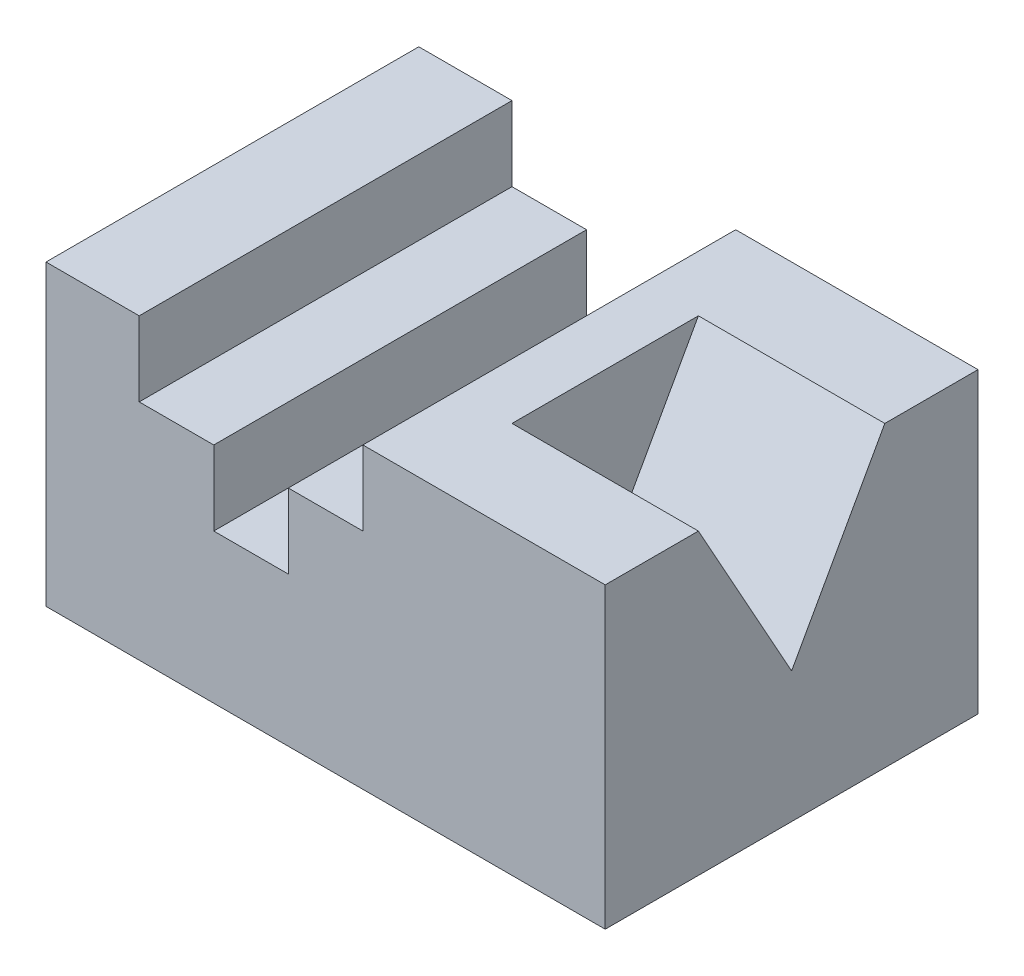
ISO-10303-21;
HEADER;
FILE_DESCRIPTION(('STEP AP214'),'2;1');
FILE_NAME('part.step','',(''),(''),'','','');
FILE_SCHEMA(('AUTOMOTIVE_DESIGN { 1 0 10303 214 1 1 1 1 }'));
ENDSEC;
DATA;
#1=APPLICATION_CONTEXT('core data for automotive mechanical design processes');
#2=APPLICATION_PROTOCOL_DEFINITION('international standard','automotive_design',2000,#1);
#3=PRODUCT_CONTEXT('',#1,'mechanical');
#4=PRODUCT('Part','Part','',(#3));
#5=PRODUCT_RELATED_PRODUCT_CATEGORY('part','',(#4));
#6=PRODUCT_DEFINITION_FORMATION('','',#4);
#7=PRODUCT_DEFINITION_CONTEXT('part definition',#1,'design');
#8=PRODUCT_DEFINITION('design','',#6,#7);
#9=PRODUCT_DEFINITION_SHAPE('','',#8);
#10=(LENGTH_UNIT() NAMED_UNIT(*) SI_UNIT(.MILLI.,.METRE.));
#11=(NAMED_UNIT(*) PLANE_ANGLE_UNIT() SI_UNIT($,.RADIAN.));
#12=(NAMED_UNIT(*) SI_UNIT($,.STERADIAN.) SOLID_ANGLE_UNIT());
#13=UNCERTAINTY_MEASURE_WITH_UNIT(LENGTH_MEASURE(1.E-05),#10,'distance_accuracy_value','');
#14=(GEOMETRIC_REPRESENTATION_CONTEXT(3) GLOBAL_UNCERTAINTY_ASSIGNED_CONTEXT((#13)) GLOBAL_UNIT_ASSIGNED_CONTEXT((#10,
#11,#12)) REPRESENTATION_CONTEXT('',''));
#15=CARTESIAN_POINT('',(0.,0.,0.));
#16=DIRECTION('',(0.,0.,1.));
#17=DIRECTION('',(1.,0.,0.));
#18=AXIS2_PLACEMENT_3D('',#15,#16,#17);
#19=CARTESIAN_POINT('',(150.,0.,50.));
#20=DIRECTION('',(0.,1.,0.));
#21=DIRECTION('',(0.,0.,1.));
#22=AXIS2_PLACEMENT_3D('',#19,#20,#21);
#23=PLANE('',#22);
#24=DIRECTION('',(1.,0.,0.));
#25=VECTOR('',#24,1.);
#26=CARTESIAN_POINT('',(150.,0.,-50.));
#27=LINE('',#26,#25);
#28=CARTESIAN_POINT('',(0.,0.,-50.));
#29=VERTEX_POINT('',#28);
#30=CARTESIAN_POINT('',(150.,0.,-50.));
#31=VERTEX_POINT('',#30);
#32=EDGE_CURVE('E171',#29,#31,#27,.T.);
#33=ORIENTED_EDGE('',*,*,#32,.T.);
#34=DIRECTION('',(0.,0.,-1.));
#35=VECTOR('',#34,1.);
#36=CARTESIAN_POINT('',(150.,0.,50.));
#37=LINE('',#36,#35);
#38=CARTESIAN_POINT('',(150.,0.,50.));
#39=VERTEX_POINT('',#38);
#40=EDGE_CURVE('E11',#39,#31,#37,.T.);
#41=ORIENTED_EDGE('',*,*,#40,.F.);
#42=DIRECTION('',(1.,0.,0.));
#43=VECTOR('',#42,1.);
#44=CARTESIAN_POINT('',(150.,0.,50.));
#45=LINE('',#44,#43);
#46=CARTESIAN_POINT('',(0.,0.,50.));
#47=VERTEX_POINT('',#46);
#48=EDGE_CURVE('E196',#47,#39,#45,.T.);
#49=ORIENTED_EDGE('',*,*,#48,.F.);
#50=DIRECTION('',(0.,0.,-1.));
#51=VECTOR('',#50,1.);
#52=CARTESIAN_POINT('',(0.,0.,50.));
#53=LINE('',#52,#51);
#54=EDGE_CURVE('E167',#47,#29,#53,.T.);
#55=ORIENTED_EDGE('',*,*,#54,.T.);
#56=EDGE_LOOP('',(#33,#41,#49,#55));
#57=FACE_BOUND('',#56,.T.);
#58=ADVANCED_FACE('F39',(#57),#23,.F.);
#59=CARTESIAN_POINT('',(150.,80.,50.));
#60=DIRECTION('',(-1.,0.,0.));
#61=DIRECTION('',(0.,0.,1.));
#62=AXIS2_PLACEMENT_3D('',#59,#60,#61);
#63=PLANE('',#62);
#64=DIRECTION('',(0.,0.874157276121538,-0.485642931178632));
#65=VECTOR('',#64,1.);
#66=CARTESIAN_POINT('',(150.,48.1603773584906,-7.31132075471699));
#67=LINE('',#66,#65);
#68=CARTESIAN_POINT('',(150.,35.,0.));
#69=VERTEX_POINT('',#68);
#70=CARTESIAN_POINT('',(150.,80.,-25.));
#71=VERTEX_POINT('',#70);
#72=EDGE_CURVE('E283',#69,#71,#67,.T.);
#73=ORIENTED_EDGE('',*,*,#72,.F.);
#74=DIRECTION('',(0.,-0.874157276121538,-0.485642931178632));
#75=VECTOR('',#74,1.);
#76=CARTESIAN_POINT('',(150.,90.6132075471698,30.8962264150943));
#77=LINE('',#76,#75);
#78=CARTESIAN_POINT('',(150.,80.,25.));
#79=VERTEX_POINT('',#78);
#80=EDGE_CURVE('E280',#79,#69,#77,.T.);
#81=ORIENTED_EDGE('',*,*,#80,.F.);
#82=DIRECTION('',(0.,0.,-1.));
#83=VECTOR('',#82,1.);
#84=CARTESIAN_POINT('',(150.,80.,50.));
#85=LINE('',#84,#83);
#86=CARTESIAN_POINT('',(150.,80.,50.));
#87=VERTEX_POINT('',#86);
#88=EDGE_CURVE('E46',#87,#79,#85,.T.);
#89=ORIENTED_EDGE('',*,*,#88,.F.);
#90=DIRECTION('',(0.,1.,0.));
#91=VECTOR('',#90,1.);
#92=CARTESIAN_POINT('',(150.,80.,50.));
#93=LINE('',#92,#91);
#94=EDGE_CURVE('E115',#39,#87,#93,.T.);
#95=ORIENTED_EDGE('',*,*,#94,.F.);
#96=ORIENTED_EDGE('',*,*,#40,.T.);
#97=DIRECTION('',(0.,1.,0.));
#98=VECTOR('',#97,1.);
#99=CARTESIAN_POINT('',(150.,80.,-50.));
#100=LINE('',#99,#98);
#101=CARTESIAN_POINT('',(150.,80.,-50.));
#102=VERTEX_POINT('',#101);
#103=EDGE_CURVE('E174',#31,#102,#100,.T.);
#104=ORIENTED_EDGE('',*,*,#103,.T.);
#105=EDGE_CURVE('E217',#71,#102,#85,.T.);
#106=ORIENTED_EDGE('',*,*,#105,.F.);
#107=EDGE_LOOP('',(#73,#81,#89,#95,#96,#104,#106));
#108=FACE_BOUND('',#107,.T.);
#109=ADVANCED_FACE('F231',(#108),#63,.F.);
#110=CARTESIAN_POINT('',(85.,80.,50.));
#111=DIRECTION('',(0.,-1.,0.));
#112=DIRECTION('',(0.,0.,-1.));
#113=AXIS2_PLACEMENT_3D('',#110,#111,#112);
#114=PLANE('',#113);
#115=ORIENTED_EDGE('',*,*,#88,.T.);
#116=DIRECTION('',(1.,0.,0.));
#117=VECTOR('',#116,1.);
#118=CARTESIAN_POINT('',(100.,80.,25.));
#119=LINE('',#118,#117);
#120=CARTESIAN_POINT('',(100.,80.,25.));
#121=VERTEX_POINT('',#120);
#122=EDGE_CURVE('E175',#121,#79,#119,.T.);
#123=ORIENTED_EDGE('',*,*,#122,.F.);
#124=DIRECTION('',(0.,0.,1.));
#125=VECTOR('',#124,1.);
#126=CARTESIAN_POINT('',(100.,80.,50.));
#127=LINE('',#126,#125);
#128=CARTESIAN_POINT('',(100.,80.,-25.));
#129=VERTEX_POINT('',#128);
#130=EDGE_CURVE('E292',#129,#121,#127,.T.);
#131=ORIENTED_EDGE('',*,*,#130,.F.);
#132=DIRECTION('',(1.,0.,0.));
#133=VECTOR('',#132,1.);
#134=CARTESIAN_POINT('',(100.,80.,-25.));
#135=LINE('',#134,#133);
#136=EDGE_CURVE('E229',#129,#71,#135,.T.);
#137=ORIENTED_EDGE('',*,*,#136,.T.);
#138=ORIENTED_EDGE('',*,*,#105,.T.);
#139=DIRECTION('',(-1.,0.,0.));
#140=VECTOR('',#139,1.);
#141=CARTESIAN_POINT('',(85.,80.,-50.));
#142=LINE('',#141,#140);
#143=CARTESIAN_POINT('',(85.,80.,-50.));
#144=VERTEX_POINT('',#143);
#145=EDGE_CURVE('E178',#102,#144,#142,.T.);
#146=ORIENTED_EDGE('',*,*,#145,.T.);
#147=DIRECTION('',(0.,0.,-1.));
#148=VECTOR('',#147,1.);
#149=CARTESIAN_POINT('',(85.,80.,50.));
#150=LINE('',#149,#148);
#151=CARTESIAN_POINT('',(85.,80.,50.));
#152=VERTEX_POINT('',#151);
#153=EDGE_CURVE('E215',#152,#144,#150,.T.);
#154=ORIENTED_EDGE('',*,*,#153,.F.);
#155=DIRECTION('',(-1.,0.,0.));
#156=VECTOR('',#155,1.);
#157=CARTESIAN_POINT('',(85.,80.,50.));
#158=LINE('',#157,#156);
#159=EDGE_CURVE('E254',#87,#152,#158,.T.);
#160=ORIENTED_EDGE('',*,*,#159,.F.);
#161=EDGE_LOOP('',(#115,#123,#131,#137,#138,#146,#154,#160));
#162=FACE_BOUND('',#161,.T.);
#163=ADVANCED_FACE('F224',(#162),#114,.F.);
#164=CARTESIAN_POINT('',(85.,60.,50.));
#165=DIRECTION('',(1.,0.,0.));
#166=DIRECTION('',(0.,1.,0.));
#167=AXIS2_PLACEMENT_3D('',#164,#165,#166);
#168=PLANE('',#167);
#169=DIRECTION('',(0.,-1.,0.));
#170=VECTOR('',#169,1.);
#171=CARTESIAN_POINT('',(85.,60.,-50.));
#172=LINE('',#171,#170);
#173=CARTESIAN_POINT('',(85.,60.,-50.));
#174=VERTEX_POINT('',#173);
#175=EDGE_CURVE('E180',#144,#174,#172,.T.);
#176=ORIENTED_EDGE('',*,*,#175,.T.);
#177=DIRECTION('',(0.,0.,-1.));
#178=VECTOR('',#177,1.);
#179=CARTESIAN_POINT('',(85.,60.,50.));
#180=LINE('',#179,#178);
#181=CARTESIAN_POINT('',(85.,60.,50.));
#182=VERTEX_POINT('',#181);
#183=EDGE_CURVE('E212',#182,#174,#180,.T.);
#184=ORIENTED_EDGE('',*,*,#183,.F.);
#185=DIRECTION('',(0.,-1.,0.));
#186=VECTOR('',#185,1.);
#187=CARTESIAN_POINT('',(85.,60.,50.));
#188=LINE('',#187,#186);
#189=EDGE_CURVE('E250',#152,#182,#188,.T.);
#190=ORIENTED_EDGE('',*,*,#189,.F.);
#191=ORIENTED_EDGE('',*,*,#153,.T.);
#192=EDGE_LOOP('',(#176,#184,#190,#191));
#193=FACE_BOUND('',#192,.T.);
#194=ADVANCED_FACE('F241',(#193),#168,.F.);
#195=CARTESIAN_POINT('',(65.0000000000001,60.,50.));
#196=DIRECTION('',(0.,-1.,0.));
#197=DIRECTION('',(0.,0.,-1.));
#198=AXIS2_PLACEMENT_3D('',#195,#196,#197);
#199=PLANE('',#198);
#200=DIRECTION('',(-1.,0.,0.));
#201=VECTOR('',#200,1.);
#202=CARTESIAN_POINT('',(65.0000000000001,60.,-50.));
#203=LINE('',#202,#201);
#204=CARTESIAN_POINT('',(65.0000000000001,60.,-50.));
#205=VERTEX_POINT('',#204);
#206=EDGE_CURVE('E182',#174,#205,#203,.T.);
#207=ORIENTED_EDGE('',*,*,#206,.T.);
#208=DIRECTION('',(0.,0.,-1.));
#209=VECTOR('',#208,1.);
#210=CARTESIAN_POINT('',(65.0000000000001,60.,50.));
#211=LINE('',#210,#209);
#212=CARTESIAN_POINT('',(65.0000000000001,60.,50.));
#213=VERTEX_POINT('',#212);
#214=EDGE_CURVE('E209',#213,#205,#211,.T.);
#215=ORIENTED_EDGE('',*,*,#214,.F.);
#216=DIRECTION('',(-1.,0.,0.));
#217=VECTOR('',#216,1.);
#218=CARTESIAN_POINT('',(65.0000000000001,60.,50.));
#219=LINE('',#218,#217);
#220=EDGE_CURVE('E247',#182,#213,#219,.T.);
#221=ORIENTED_EDGE('',*,*,#220,.F.);
#222=ORIENTED_EDGE('',*,*,#183,.T.);
#223=EDGE_LOOP('',(#207,#215,#221,#222));
#224=FACE_BOUND('',#223,.T.);
#225=ADVANCED_FACE('F245',(#224),#199,.F.);
#226=CARTESIAN_POINT('',(65.0000000000001,40.,50.));
#227=DIRECTION('',(1.,0.,0.));
#228=DIRECTION('',(0.,0.,-1.));
#229=AXIS2_PLACEMENT_3D('',#226,#227,#228);
#230=PLANE('',#229);
#231=DIRECTION('',(0.,-1.,0.));
#232=VECTOR('',#231,1.);
#233=CARTESIAN_POINT('',(65.0000000000001,40.,-50.));
#234=LINE('',#233,#232);
#235=CARTESIAN_POINT('',(65.0000000000001,40.,-50.));
#236=VERTEX_POINT('',#235);
#237=EDGE_CURVE('E184',#205,#236,#234,.T.);
#238=ORIENTED_EDGE('',*,*,#237,.T.);
#239=DIRECTION('',(0.,0.,-1.));
#240=VECTOR('',#239,1.);
#241=CARTESIAN_POINT('',(65.0000000000001,40.,50.));
#242=LINE('',#241,#240);
#243=CARTESIAN_POINT('',(65.0000000000001,40.,50.));
#244=VERTEX_POINT('',#243);
#245=EDGE_CURVE('E206',#244,#236,#242,.T.);
#246=ORIENTED_EDGE('',*,*,#245,.F.);
#247=DIRECTION('',(0.,-1.,0.));
#248=VECTOR('',#247,1.);
#249=CARTESIAN_POINT('',(65.0000000000001,40.,50.));
#250=LINE('',#249,#248);
#251=EDGE_CURVE('E249',#213,#244,#250,.T.);
#252=ORIENTED_EDGE('',*,*,#251,.F.);
#253=ORIENTED_EDGE('',*,*,#214,.T.);
#254=EDGE_LOOP('',(#238,#246,#252,#253));
#255=FACE_BOUND('',#254,.T.);
#256=ADVANCED_FACE('F327',(#255),#230,.F.);
#257=CARTESIAN_POINT('',(45.0000000000001,40.,50.));
#258=DIRECTION('',(0.,-1.,0.));
#259=DIRECTION('',(0.,0.,-1.));
#260=AXIS2_PLACEMENT_3D('',#257,#258,#259);
#261=PLANE('',#260);
#262=DIRECTION('',(-1.,0.,0.));
#263=VECTOR('',#262,1.);
#264=CARTESIAN_POINT('',(45.0000000000001,40.,-50.));
#265=LINE('',#264,#263);
#266=CARTESIAN_POINT('',(45.0000000000001,40.,-50.));
#267=VERTEX_POINT('',#266);
#268=EDGE_CURVE('E186',#236,#267,#265,.T.);
#269=ORIENTED_EDGE('',*,*,#268,.T.);
#270=DIRECTION('',(0.,0.,-1.));
#271=VECTOR('',#270,1.);
#272=CARTESIAN_POINT('',(45.0000000000001,40.,50.));
#273=LINE('',#272,#271);
#274=CARTESIAN_POINT('',(45.0000000000001,40.,50.));
#275=VERTEX_POINT('',#274);
#276=EDGE_CURVE('E203',#275,#267,#273,.T.);
#277=ORIENTED_EDGE('',*,*,#276,.F.);
#278=DIRECTION('',(-1.,0.,0.));
#279=VECTOR('',#278,1.);
#280=CARTESIAN_POINT('',(45.0000000000001,40.,50.));
#281=LINE('',#280,#279);
#282=EDGE_CURVE('E252',#244,#275,#281,.T.);
#283=ORIENTED_EDGE('',*,*,#282,.F.);
#284=ORIENTED_EDGE('',*,*,#245,.T.);
#285=EDGE_LOOP('',(#269,#277,#283,#284));
#286=FACE_BOUND('',#285,.T.);
#287=ADVANCED_FACE('F330',(#286),#261,.F.);
#288=CARTESIAN_POINT('',(45.0000000000001,60.,50.));
#289=DIRECTION('',(-1.,0.,0.));
#290=DIRECTION('',(0.,0.,1.));
#291=AXIS2_PLACEMENT_3D('',#288,#289,#290);
#292=PLANE('',#291);
#293=DIRECTION('',(0.,1.,0.));
#294=VECTOR('',#293,1.);
#295=CARTESIAN_POINT('',(45.0000000000001,60.,-50.));
#296=LINE('',#295,#294);
#297=CARTESIAN_POINT('',(45.0000000000001,60.,-50.));
#298=VERTEX_POINT('',#297);
#299=EDGE_CURVE('E188',#267,#298,#296,.T.);
#300=ORIENTED_EDGE('',*,*,#299,.T.);
#301=DIRECTION('',(0.,0.,-1.));
#302=VECTOR('',#301,1.);
#303=CARTESIAN_POINT('',(45.0000000000001,60.,50.));
#304=LINE('',#303,#302);
#305=CARTESIAN_POINT('',(45.0000000000001,60.,50.));
#306=VERTEX_POINT('',#305);
#307=EDGE_CURVE('E200',#306,#298,#304,.T.);
#308=ORIENTED_EDGE('',*,*,#307,.F.);
#309=DIRECTION('',(0.,1.,0.));
#310=VECTOR('',#309,1.);
#311=CARTESIAN_POINT('',(45.0000000000001,60.,50.));
#312=LINE('',#311,#310);
#313=EDGE_CURVE('E259',#275,#306,#312,.T.);
#314=ORIENTED_EDGE('',*,*,#313,.F.);
#315=ORIENTED_EDGE('',*,*,#276,.T.);
#316=EDGE_LOOP('',(#300,#308,#314,#315));
#317=FACE_BOUND('',#316,.T.);
#318=ADVANCED_FACE('F265',(#317),#292,.F.);
#319=CARTESIAN_POINT('',(25.,60.,50.));
#320=DIRECTION('',(0.,-1.,0.));
#321=DIRECTION('',(0.,0.,-1.));
#322=AXIS2_PLACEMENT_3D('',#319,#320,#321);
#323=PLANE('',#322);
#324=DIRECTION('',(-1.,0.,0.));
#325=VECTOR('',#324,1.);
#326=CARTESIAN_POINT('',(25.,60.,-50.));
#327=LINE('',#326,#325);
#328=CARTESIAN_POINT('',(25.,60.,-50.));
#329=VERTEX_POINT('',#328);
#330=EDGE_CURVE('E190',#298,#329,#327,.T.);
#331=ORIENTED_EDGE('',*,*,#330,.T.);
#332=DIRECTION('',(0.,0.,-1.));
#333=VECTOR('',#332,1.);
#334=CARTESIAN_POINT('',(25.,60.,50.));
#335=LINE('',#334,#333);
#336=CARTESIAN_POINT('',(25.,60.,50.));
#337=VERTEX_POINT('',#336);
#338=EDGE_CURVE('E162',#337,#329,#335,.T.);
#339=ORIENTED_EDGE('',*,*,#338,.F.);
#340=DIRECTION('',(-1.,0.,0.));
#341=VECTOR('',#340,1.);
#342=CARTESIAN_POINT('',(25.,60.,50.));
#343=LINE('',#342,#341);
#344=EDGE_CURVE('E150',#306,#337,#343,.T.);
#345=ORIENTED_EDGE('',*,*,#344,.F.);
#346=ORIENTED_EDGE('',*,*,#307,.T.);
#347=EDGE_LOOP('',(#331,#339,#345,#346));
#348=FACE_BOUND('',#347,.T.);
#349=ADVANCED_FACE('F269',(#348),#323,.F.);
#350=CARTESIAN_POINT('',(25.,80.,50.));
#351=DIRECTION('',(-1.,0.,0.));
#352=DIRECTION('',(0.,0.,1.));
#353=AXIS2_PLACEMENT_3D('',#350,#351,#352);
#354=PLANE('',#353);
#355=DIRECTION('',(0.,1.,0.));
#356=VECTOR('',#355,1.);
#357=CARTESIAN_POINT('',(25.,80.,-50.));
#358=LINE('',#357,#356);
#359=CARTESIAN_POINT('',(25.,80.,-50.));
#360=VERTEX_POINT('',#359);
#361=EDGE_CURVE('E159',#329,#360,#358,.T.);
#362=ORIENTED_EDGE('',*,*,#361,.T.);
#363=DIRECTION('',(0.,0.,-1.));
#364=VECTOR('',#363,1.);
#365=CARTESIAN_POINT('',(25.,80.,50.));
#366=LINE('',#365,#364);
#367=CARTESIAN_POINT('',(25.,80.,50.));
#368=VERTEX_POINT('',#367);
#369=EDGE_CURVE('E156',#368,#360,#366,.T.);
#370=ORIENTED_EDGE('',*,*,#369,.F.);
#371=DIRECTION('',(0.,1.,0.));
#372=VECTOR('',#371,1.);
#373=CARTESIAN_POINT('',(25.,80.,50.));
#374=LINE('',#373,#372);
#375=EDGE_CURVE('E143',#337,#368,#374,.T.);
#376=ORIENTED_EDGE('',*,*,#375,.F.);
#377=ORIENTED_EDGE('',*,*,#338,.T.);
#378=EDGE_LOOP('',(#362,#370,#376,#377));
#379=FACE_BOUND('',#378,.T.);
#380=ADVANCED_FACE('F157',(#379),#354,.F.);
#381=CARTESIAN_POINT('',(0.,80.,50.));
#382=DIRECTION('',(0.,-1.,0.));
#383=DIRECTION('',(0.,0.,-1.));
#384=AXIS2_PLACEMENT_3D('',#381,#382,#383);
#385=PLANE('',#384);
#386=DIRECTION('',(-1.,0.,0.));
#387=VECTOR('',#386,1.);
#388=CARTESIAN_POINT('',(0.,80.,-50.));
#389=LINE('',#388,#387);
#390=CARTESIAN_POINT('',(0.,80.,-50.));
#391=VERTEX_POINT('',#390);
#392=EDGE_CURVE('E193',#360,#391,#389,.T.);
#393=ORIENTED_EDGE('',*,*,#392,.T.);
#394=DIRECTION('',(0.,0.,-1.));
#395=VECTOR('',#394,1.);
#396=CARTESIAN_POINT('',(0.,80.,50.));
#397=LINE('',#396,#395);
#398=CARTESIAN_POINT('',(0.,80.,50.));
#399=VERTEX_POINT('',#398);
#400=EDGE_CURVE('E163',#399,#391,#397,.T.);
#401=ORIENTED_EDGE('',*,*,#400,.F.);
#402=DIRECTION('',(-1.,0.,0.));
#403=VECTOR('',#402,1.);
#404=CARTESIAN_POINT('',(0.,80.,50.));
#405=LINE('',#404,#403);
#406=EDGE_CURVE('E147',#368,#399,#405,.T.);
#407=ORIENTED_EDGE('',*,*,#406,.F.);
#408=ORIENTED_EDGE('',*,*,#369,.T.);
#409=EDGE_LOOP('',(#393,#401,#407,#408));
#410=FACE_BOUND('',#409,.T.);
#411=ADVANCED_FACE('F165',(#410),#385,.F.);
#412=CARTESIAN_POINT('',(0.,0.,50.));
#413=DIRECTION('',(1.,0.,0.));
#414=DIRECTION('',(0.,0.,-1.));
#415=AXIS2_PLACEMENT_3D('',#412,#413,#414);
#416=PLANE('',#415);
#417=DIRECTION('',(0.,-1.,0.));
#418=VECTOR('',#417,1.);
#419=CARTESIAN_POINT('',(0.,0.,-50.));
#420=LINE('',#419,#418);
#421=EDGE_CURVE('E107',#391,#29,#420,.T.);
#422=ORIENTED_EDGE('',*,*,#421,.T.);
#423=ORIENTED_EDGE('',*,*,#54,.F.);
#424=DIRECTION('',(0.,-1.,0.));
#425=VECTOR('',#424,1.);
#426=CARTESIAN_POINT('',(0.,0.,50.));
#427=LINE('',#426,#425);
#428=EDGE_CURVE('E62',#399,#47,#427,.T.);
#429=ORIENTED_EDGE('',*,*,#428,.F.);
#430=ORIENTED_EDGE('',*,*,#400,.T.);
#431=EDGE_LOOP('',(#422,#423,#429,#430));
#432=FACE_BOUND('',#431,.T.);
#433=ADVANCED_FACE('F270',(#432),#416,.F.);
#434=CARTESIAN_POINT('',(0.,0.,50.));
#435=DIRECTION('',(0.,0.,-1.));
#436=DIRECTION('',(-1.,0.,0.));
#437=AXIS2_PLACEMENT_3D('',#434,#435,#436);
#438=PLANE('',#437);
#439=ORIENTED_EDGE('',*,*,#48,.T.);
#440=ORIENTED_EDGE('',*,*,#94,.T.);
#441=ORIENTED_EDGE('',*,*,#159,.T.);
#442=ORIENTED_EDGE('',*,*,#189,.T.);
#443=ORIENTED_EDGE('',*,*,#220,.T.);
#444=ORIENTED_EDGE('',*,*,#251,.T.);
#445=ORIENTED_EDGE('',*,*,#282,.T.);
#446=ORIENTED_EDGE('',*,*,#313,.T.);
#447=ORIENTED_EDGE('',*,*,#344,.T.);
#448=ORIENTED_EDGE('',*,*,#375,.T.);
#449=ORIENTED_EDGE('',*,*,#406,.T.);
#450=ORIENTED_EDGE('',*,*,#428,.T.);
#451=EDGE_LOOP('',(#439,#440,#441,#442,#443,#444,#445,#446,#447,#448,#449,#450));
#452=FACE_BOUND('',#451,.T.);
#453=ADVANCED_FACE('F145',(#452),#438,.F.);
#454=CARTESIAN_POINT('',(0.,0.,-50.));
#455=DIRECTION('',(0.,0.,-1.));
#456=DIRECTION('',(-1.,0.,0.));
#457=AXIS2_PLACEMENT_3D('',#454,#455,#456);
#458=PLANE('',#457);
#459=ORIENTED_EDGE('',*,*,#32,.F.);
#460=ORIENTED_EDGE('',*,*,#421,.F.);
#461=ORIENTED_EDGE('',*,*,#392,.F.);
#462=ORIENTED_EDGE('',*,*,#361,.F.);
#463=ORIENTED_EDGE('',*,*,#330,.F.);
#464=ORIENTED_EDGE('',*,*,#299,.F.);
#465=ORIENTED_EDGE('',*,*,#268,.F.);
#466=ORIENTED_EDGE('',*,*,#237,.F.);
#467=ORIENTED_EDGE('',*,*,#206,.F.);
#468=ORIENTED_EDGE('',*,*,#175,.F.);
#469=ORIENTED_EDGE('',*,*,#145,.F.);
#470=ORIENTED_EDGE('',*,*,#103,.F.);
#471=EDGE_LOOP('',(#459,#460,#461,#462,#463,#464,#465,#466,#467,#468,#469,#470));
#472=FACE_BOUND('',#471,.T.);
#473=ADVANCED_FACE('F236',(#472),#458,.T.);
#474=CARTESIAN_POINT('',(100.,90.6132075471698,30.8962264150943));
#475=DIRECTION('',(0.,-0.485642931178632,0.874157276121538));
#476=DIRECTION('',(0.,-0.874157276121538,-0.485642931178632));
#477=AXIS2_PLACEMENT_3D('',#474,#475,#476);
#478=PLANE('',#477);
#479=ORIENTED_EDGE('',*,*,#80,.T.);
#480=DIRECTION('',(1.,0.,0.));
#481=VECTOR('',#480,1.);
#482=CARTESIAN_POINT('',(100.,35.,0.));
#483=LINE('',#482,#481);
#484=CARTESIAN_POINT('',(100.,35.,0.));
#485=VERTEX_POINT('',#484);
#486=EDGE_CURVE('E276',#485,#69,#483,.T.);
#487=ORIENTED_EDGE('',*,*,#486,.F.);
#488=DIRECTION('',(0.,-0.874157276121538,-0.485642931178632));
#489=VECTOR('',#488,1.);
#490=CARTESIAN_POINT('',(100.,90.6132075471698,30.8962264150943));
#491=LINE('',#490,#489);
#492=EDGE_CURVE('E289',#121,#485,#491,.T.);
#493=ORIENTED_EDGE('',*,*,#492,.F.);
#494=ORIENTED_EDGE('',*,*,#122,.T.);
#495=EDGE_LOOP('',(#479,#487,#493,#494));
#496=FACE_BOUND('',#495,.T.);
#497=ADVANCED_FACE('F301',(#496),#478,.F.);
#498=CARTESIAN_POINT('',(100.,48.1603773584906,-7.31132075471699));
#499=DIRECTION('',(0.,-0.485642931178632,-0.874157276121538));
#500=DIRECTION('',(0.,0.874157276121538,-0.485642931178632));
#501=AXIS2_PLACEMENT_3D('',#498,#499,#500);
#502=PLANE('',#501);
#503=ORIENTED_EDGE('',*,*,#72,.T.);
#504=ORIENTED_EDGE('',*,*,#136,.F.);
#505=DIRECTION('',(0.,0.874157276121538,-0.485642931178632));
#506=VECTOR('',#505,1.);
#507=CARTESIAN_POINT('',(100.,48.1603773584906,-7.31132075471699));
#508=LINE('',#507,#506);
#509=EDGE_CURVE('E53',#485,#129,#508,.T.);
#510=ORIENTED_EDGE('',*,*,#509,.F.);
#511=ORIENTED_EDGE('',*,*,#486,.T.);
#512=EDGE_LOOP('',(#503,#504,#510,#511));
#513=FACE_BOUND('',#512,.T.);
#514=ADVANCED_FACE('F304',(#513),#502,.F.);
#515=CARTESIAN_POINT('',(100.,0.,0.));
#516=DIRECTION('',(-1.,0.,0.));
#517=DIRECTION('',(0.,0.,1.));
#518=AXIS2_PLACEMENT_3D('',#515,#516,#517);
#519=PLANE('',#518);
#520=ORIENTED_EDGE('',*,*,#492,.T.);
#521=ORIENTED_EDGE('',*,*,#509,.T.);
#522=ORIENTED_EDGE('',*,*,#130,.T.);
#523=EDGE_LOOP('',(#520,#521,#522));
#524=FACE_BOUND('',#523,.T.);
#525=ADVANCED_FACE('F299',(#524),#519,.F.);
#526=CLOSED_SHELL('',(#58,#109,#163,#194,#225,#256,#287,#318,#349,#380,#411,#433,#453,#473,#497,
#514,#525));
#527=MANIFOLD_SOLID_BREP('B2',#526);
#528=ADVANCED_BREP_SHAPE_REPRESENTATION('',(#18,#527),#14);
#529=SHAPE_DEFINITION_REPRESENTATION(#9,#528);
ENDSEC;
END-ISO-10303-21;
